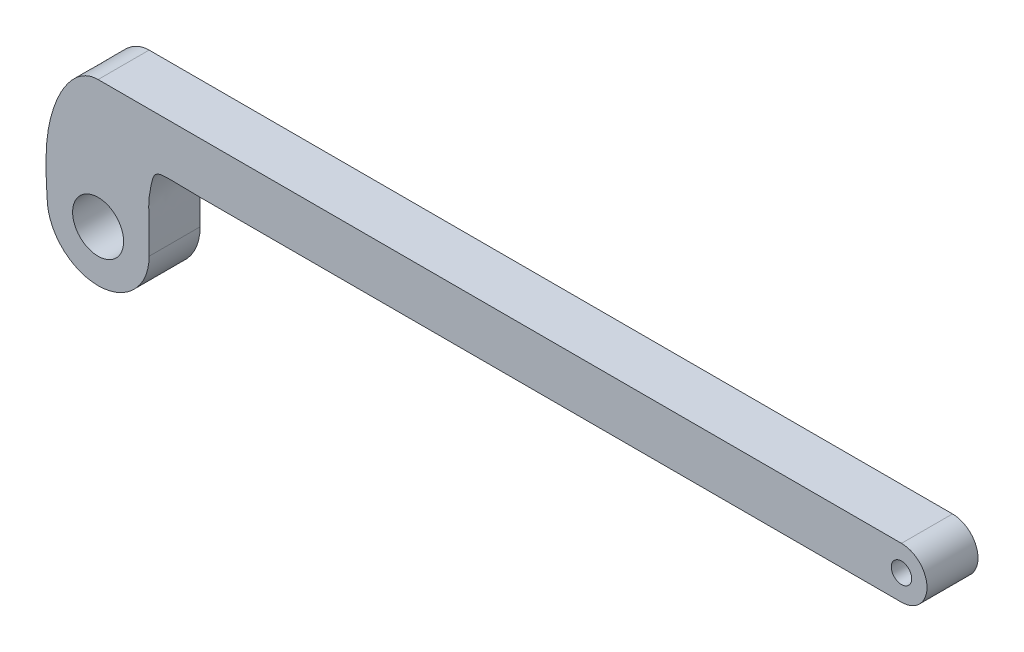
ISO-10303-21;
HEADER;
FILE_DESCRIPTION(('STEP AP214'),'2;1');
FILE_NAME('part.step','',(''),(''),'','','');
FILE_SCHEMA(('AUTOMOTIVE_DESIGN { 1 0 10303 214 1 1 1 1 }'));
ENDSEC;
DATA;
#1=APPLICATION_CONTEXT('core data for automotive mechanical design processes');
#2=APPLICATION_PROTOCOL_DEFINITION('international standard','automotive_design',2000,#1);
#3=PRODUCT_CONTEXT('',#1,'mechanical');
#4=PRODUCT('Part','Part','',(#3));
#5=PRODUCT_RELATED_PRODUCT_CATEGORY('part','',(#4));
#6=PRODUCT_DEFINITION_FORMATION('','',#4);
#7=PRODUCT_DEFINITION_CONTEXT('part definition',#1,'design');
#8=PRODUCT_DEFINITION('design','',#6,#7);
#9=PRODUCT_DEFINITION_SHAPE('','',#8);
#10=(LENGTH_UNIT() NAMED_UNIT(*) SI_UNIT(.MILLI.,.METRE.));
#11=(NAMED_UNIT(*) PLANE_ANGLE_UNIT() SI_UNIT($,.RADIAN.));
#12=(NAMED_UNIT(*) SI_UNIT($,.STERADIAN.) SOLID_ANGLE_UNIT());
#13=UNCERTAINTY_MEASURE_WITH_UNIT(LENGTH_MEASURE(1.E-05),#10,'distance_accuracy_value','');
#14=(GEOMETRIC_REPRESENTATION_CONTEXT(3) GLOBAL_UNCERTAINTY_ASSIGNED_CONTEXT((#13)) GLOBAL_UNIT_ASSIGNED_CONTEXT((#10,
#11,#12)) REPRESENTATION_CONTEXT('',''));
#15=CARTESIAN_POINT('',(0.,0.,0.));
#16=DIRECTION('',(0.,0.,1.));
#17=DIRECTION('',(1.,0.,0.));
#18=AXIS2_PLACEMENT_3D('',#15,#16,#17);
#19=CARTESIAN_POINT('',(-8.93869827663036,15.1604859074492,10.));
#20=DIRECTION('',(0.,0.,-1.));
#21=DIRECTION('',(-1.,0.,0.));
#22=AXIS2_PLACEMENT_3D('',#19,#20,#21);
#23=PLANE('',#22);
#24=CARTESIAN_POINT('',(0.,25.,10.));
#25=CARTESIAN_POINT('',(-4.93138797100949,25.,10.));
#26=CARTESIAN_POINT('',(-11.4057800435353,14.2397096644442,10.));
#27=CARTESIAN_POINT('',(-10.,0.681079819004998,10.));
#28=CARTESIAN_POINT('',(-10.,0.,10.));
#29=B_SPLINE_CURVE_WITH_KNOTS('',3,(#24,#25,#26,#27,#28),.UNSPECIFIED.,.F.,.F.,(4,1,4),(0.,
0.643210827674669,1.),.UNSPECIFIED.);
#30=CARTESIAN_POINT('',(0.,25.,10.));
#31=VERTEX_POINT('',#30);
#32=CARTESIAN_POINT('',(-10.,0.,10.));
#33=VERTEX_POINT('',#32);
#34=EDGE_CURVE('E146',#31,#33,#29,.T.);
#35=ORIENTED_EDGE('',*,*,#34,.T.);
#36=CARTESIAN_POINT('',(0.,0.,10.));
#37=DIRECTION('',(0.,0.,1.));
#38=DIRECTION('',(1.,0.,0.));
#39=AXIS2_PLACEMENT_3D('',#36,#37,#38);
#40=CIRCLE('',#39,10.);
#41=CARTESIAN_POINT('',(10.,0.,10.));
#42=VERTEX_POINT('',#41);
#43=EDGE_CURVE('E94',#33,#42,#40,.T.);
#44=ORIENTED_EDGE('',*,*,#43,.T.);
#45=CARTESIAN_POINT('',(10.,0.,10.));
#46=CARTESIAN_POINT('',(10.,6.79023703462106,10.));
#47=CARTESIAN_POINT('',(9.7760884483539,8.98660545435838,10.));
#48=CARTESIAN_POINT('',(11.0749283819489,16.1248158754713,10.));
#49=CARTESIAN_POINT('',(11.1995030270169,15.,10.));
#50=CARTESIAN_POINT('',(20.,15.,10.));
#51=B_SPLINE_CURVE_WITH_KNOTS('',3,(#45,#46,#47,#48,#49,#50),.UNSPECIFIED.,.F.,.F.,(4,1,1,4),
(0.,0.182751564047275,0.282751564047274,1.),.UNSPECIFIED.);
#52=CARTESIAN_POINT('',(20.,15.,10.));
#53=VERTEX_POINT('',#52);
#54=EDGE_CURVE('E107',#42,#53,#51,.T.);
#55=ORIENTED_EDGE('',*,*,#54,.T.);
#56=DIRECTION('',(1.,0.,0.));
#57=VECTOR('',#56,1.);
#58=CARTESIAN_POINT('',(20.,15.,10.));
#59=LINE('',#58,#57);
#60=CARTESIAN_POINT('',(157.485,15.,10.));
#61=VERTEX_POINT('',#60);
#62=EDGE_CURVE('E101',#53,#61,#59,.T.);
#63=ORIENTED_EDGE('',*,*,#62,.T.);
#64=CARTESIAN_POINT('',(157.485,20.,10.));
#65=DIRECTION('',(0.,0.,1.));
#66=DIRECTION('',(1.,0.,0.));
#67=AXIS2_PLACEMENT_3D('',#64,#65,#66);
#68=CIRCLE('',#67,5.);
#69=CARTESIAN_POINT('',(157.485,25.,10.));
#70=VERTEX_POINT('',#69);
#71=EDGE_CURVE('E105',#61,#70,#68,.T.);
#72=ORIENTED_EDGE('',*,*,#71,.T.);
#73=DIRECTION('',(-1.,0.,0.));
#74=VECTOR('',#73,1.);
#75=CARTESIAN_POINT('',(0.,25.,10.));
#76=LINE('',#75,#74);
#77=EDGE_CURVE('E57',#70,#31,#76,.T.);
#78=ORIENTED_EDGE('',*,*,#77,.T.);
#79=EDGE_LOOP('',(#35,#44,#55,#63,#72,#78));
#80=FACE_BOUND('',#79,.T.);
#81=CARTESIAN_POINT('',(0.,0.,10.));
#82=DIRECTION('',(0.,0.,1.));
#83=DIRECTION('',(1.,0.,0.));
#84=AXIS2_PLACEMENT_3D('',#81,#82,#83);
#85=CIRCLE('',#84,5.);
#86=CARTESIAN_POINT('',(5.,0.,10.));
#87=VERTEX_POINT('',#86);
#88=EDGE_CURVE('E131',#87,#87,#85,.T.);
#89=ORIENTED_EDGE('',*,*,#88,.F.);
#90=EDGE_LOOP('',(#89));
#91=FACE_BOUND('',#90,.T.);
#92=CARTESIAN_POINT('',(157.485,20.,10.));
#93=DIRECTION('',(0.,0.,1.));
#94=DIRECTION('',(1.,0.,0.));
#95=AXIS2_PLACEMENT_3D('',#92,#93,#94);
#96=CIRCLE('',#95,2.00000000000001);
#97=CARTESIAN_POINT('',(159.485,20.,10.));
#98=VERTEX_POINT('',#97);
#99=EDGE_CURVE('E187',#98,#98,#96,.T.);
#100=ORIENTED_EDGE('',*,*,#99,.F.);
#101=EDGE_LOOP('',(#100));
#102=FACE_BOUND('',#101,.T.);
#103=ADVANCED_FACE('F39',(#80,#91,#102),#23,.F.);
#104=CARTESIAN_POINT('',(-8.93869827663036,15.1604859074492,0.));
#105=DIRECTION('',(0.,0.,-1.));
#106=DIRECTION('',(-1.,0.,0.));
#107=AXIS2_PLACEMENT_3D('',#104,#105,#106);
#108=PLANE('',#107);
#109=CARTESIAN_POINT('',(0.,0.,0.));
#110=DIRECTION('',(0.,0.,1.));
#111=DIRECTION('',(1.,0.,0.));
#112=AXIS2_PLACEMENT_3D('',#109,#110,#111);
#113=CIRCLE('',#112,5.);
#114=CARTESIAN_POINT('',(5.,0.,0.));
#115=VERTEX_POINT('',#114);
#116=EDGE_CURVE('E192',#115,#115,#113,.T.);
#117=ORIENTED_EDGE('',*,*,#116,.T.);
#118=EDGE_LOOP('',(#117));
#119=FACE_BOUND('',#118,.T.);
#120=CARTESIAN_POINT('',(0.,25.,0.));
#121=CARTESIAN_POINT('',(-4.93138797100949,25.,0.));
#122=CARTESIAN_POINT('',(-11.4057800435353,14.2397096644442,0.));
#123=CARTESIAN_POINT('',(-10.,0.681079819004998,0.));
#124=CARTESIAN_POINT('',(-10.,0.,0.));
#125=B_SPLINE_CURVE_WITH_KNOTS('',3,(#120,#121,#122,#123,#124),.UNSPECIFIED.,.F.,.F.,(4,1,4),
(0.,0.643210827674669,1.),.UNSPECIFIED.);
#126=CARTESIAN_POINT('',(0.,25.,0.));
#127=VERTEX_POINT('',#126);
#128=CARTESIAN_POINT('',(-10.,0.,0.));
#129=VERTEX_POINT('',#128);
#130=EDGE_CURVE('E125',#127,#129,#125,.T.);
#131=ORIENTED_EDGE('',*,*,#130,.F.);
#132=DIRECTION('',(-1.,0.,0.));
#133=VECTOR('',#132,1.);
#134=CARTESIAN_POINT('',(0.,25.,0.));
#135=LINE('',#134,#133);
#136=CARTESIAN_POINT('',(157.485,25.,0.));
#137=VERTEX_POINT('',#136);
#138=EDGE_CURVE('E86',#137,#127,#135,.T.);
#139=ORIENTED_EDGE('',*,*,#138,.F.);
#140=CARTESIAN_POINT('',(157.485,20.,0.));
#141=DIRECTION('',(0.,0.,1.));
#142=DIRECTION('',(1.,0.,0.));
#143=AXIS2_PLACEMENT_3D('',#140,#141,#142);
#144=CIRCLE('',#143,5.);
#145=CARTESIAN_POINT('',(157.485,15.,0.));
#146=VERTEX_POINT('',#145);
#147=EDGE_CURVE('E80',#146,#137,#144,.T.);
#148=ORIENTED_EDGE('',*,*,#147,.F.);
#149=DIRECTION('',(1.,0.,0.));
#150=VECTOR('',#149,1.);
#151=CARTESIAN_POINT('',(20.,15.,0.));
#152=LINE('',#151,#150);
#153=CARTESIAN_POINT('',(20.,15.,0.));
#154=VERTEX_POINT('',#153);
#155=EDGE_CURVE('E115',#154,#146,#152,.T.);
#156=ORIENTED_EDGE('',*,*,#155,.F.);
#157=CARTESIAN_POINT('',(10.,0.,0.));
#158=CARTESIAN_POINT('',(10.,6.79023703462106,0.));
#159=CARTESIAN_POINT('',(9.7760884483539,8.98660545435838,0.));
#160=CARTESIAN_POINT('',(11.0749283819489,16.1248158754713,0.));
#161=CARTESIAN_POINT('',(11.1995030270169,15.,0.));
#162=CARTESIAN_POINT('',(20.,15.,0.));
#163=B_SPLINE_CURVE_WITH_KNOTS('',3,(#157,#158,#159,#160,#161,#162),.UNSPECIFIED.,.F.,.F.,(4,1,
1,4),(0.,0.182751564047275,0.282751564047274,1.),.UNSPECIFIED.);
#164=CARTESIAN_POINT('',(10.,0.,0.));
#165=VERTEX_POINT('',#164);
#166=EDGE_CURVE('E136',#165,#154,#163,.T.);
#167=ORIENTED_EDGE('',*,*,#166,.F.);
#168=CARTESIAN_POINT('',(0.,0.,0.));
#169=DIRECTION('',(0.,0.,1.));
#170=DIRECTION('',(1.,0.,0.));
#171=AXIS2_PLACEMENT_3D('',#168,#169,#170);
#172=CIRCLE('',#171,10.);
#173=EDGE_CURVE('E130',#129,#165,#172,.T.);
#174=ORIENTED_EDGE('',*,*,#173,.F.);
#175=EDGE_LOOP('',(#131,#139,#148,#156,#167,#174));
#176=FACE_BOUND('',#175,.T.);
#177=CARTESIAN_POINT('',(157.485,20.,0.));
#178=DIRECTION('',(0.,0.,1.));
#179=DIRECTION('',(1.,0.,0.));
#180=AXIS2_PLACEMENT_3D('',#177,#178,#179);
#181=CIRCLE('',#180,2.00000000000001);
#182=CARTESIAN_POINT('',(159.485,20.,0.));
#183=VERTEX_POINT('',#182);
#184=EDGE_CURVE('E190',#183,#183,#181,.T.);
#185=ORIENTED_EDGE('',*,*,#184,.T.);
#186=EDGE_LOOP('',(#185));
#187=FACE_BOUND('',#186,.T.);
#188=ADVANCED_FACE('F155',(#119,#176,#187),#108,.T.);
#189=DIRECTION('',(0.,0.,-1.));
#190=VECTOR('',#189,1.);
#191=SURFACE_OF_LINEAR_EXTRUSION('',#29,#190);
#192=ORIENTED_EDGE('',*,*,#130,.T.);
#193=DIRECTION('',(0.,0.,-1.));
#194=VECTOR('',#193,1.);
#195=CARTESIAN_POINT('',(-10.,0.,10.));
#196=LINE('',#195,#194);
#197=EDGE_CURVE('E11',#33,#129,#196,.T.);
#198=ORIENTED_EDGE('',*,*,#197,.F.);
#199=ORIENTED_EDGE('',*,*,#34,.F.);
#200=DIRECTION('',(0.,0.,-1.));
#201=VECTOR('',#200,1.);
#202=CARTESIAN_POINT('',(0.,25.,10.));
#203=LINE('',#202,#201);
#204=EDGE_CURVE('E121',#31,#127,#203,.T.);
#205=ORIENTED_EDGE('',*,*,#204,.T.);
#206=EDGE_LOOP('',(#192,#198,#199,#205));
#207=FACE_BOUND('',#206,.T.);
#208=ADVANCED_FACE('F41',(#207),#191,.F.);
#209=CARTESIAN_POINT('',(0.,0.,10.));
#210=DIRECTION('',(0.,0.,-1.));
#211=DIRECTION('',(-1.,0.,0.));
#212=AXIS2_PLACEMENT_3D('',#209,#210,#211);
#213=CYLINDRICAL_SURFACE('',#212,10.);
#214=ORIENTED_EDGE('',*,*,#173,.T.);
#215=DIRECTION('',(0.,0.,-1.));
#216=VECTOR('',#215,1.);
#217=CARTESIAN_POINT('',(10.,0.,10.));
#218=LINE('',#217,#216);
#219=EDGE_CURVE('E49',#42,#165,#218,.T.);
#220=ORIENTED_EDGE('',*,*,#219,.F.);
#221=ORIENTED_EDGE('',*,*,#43,.F.);
#222=ORIENTED_EDGE('',*,*,#197,.T.);
#223=EDGE_LOOP('',(#214,#220,#221,#222));
#224=FACE_BOUND('',#223,.T.);
#225=ADVANCED_FACE('F214',(#224),#213,.T.);
#226=DIRECTION('',(0.,0.,-1.));
#227=VECTOR('',#226,1.);
#228=SURFACE_OF_LINEAR_EXTRUSION('',#51,#227);
#229=ORIENTED_EDGE('',*,*,#166,.T.);
#230=DIRECTION('',(0.,0.,-1.));
#231=VECTOR('',#230,1.);
#232=CARTESIAN_POINT('',(20.,15.,10.));
#233=LINE('',#232,#231);
#234=EDGE_CURVE('E116',#53,#154,#233,.T.);
#235=ORIENTED_EDGE('',*,*,#234,.F.);
#236=ORIENTED_EDGE('',*,*,#54,.F.);
#237=ORIENTED_EDGE('',*,*,#219,.T.);
#238=EDGE_LOOP('',(#229,#235,#236,#237));
#239=FACE_BOUND('',#238,.T.);
#240=ADVANCED_FACE('F152',(#239),#228,.F.);
#241=CARTESIAN_POINT('',(20.,15.,10.));
#242=DIRECTION('',(0.,1.,0.));
#243=DIRECTION('',(-1.,0.,0.));
#244=AXIS2_PLACEMENT_3D('',#241,#242,#243);
#245=PLANE('',#244);
#246=ORIENTED_EDGE('',*,*,#155,.T.);
#247=DIRECTION('',(0.,0.,-1.));
#248=VECTOR('',#247,1.);
#249=CARTESIAN_POINT('',(157.485,15.,10.));
#250=LINE('',#249,#248);
#251=EDGE_CURVE('E112',#61,#146,#250,.T.);
#252=ORIENTED_EDGE('',*,*,#251,.F.);
#253=ORIENTED_EDGE('',*,*,#62,.F.);
#254=ORIENTED_EDGE('',*,*,#234,.T.);
#255=EDGE_LOOP('',(#246,#252,#253,#254));
#256=FACE_BOUND('',#255,.T.);
#257=ADVANCED_FACE('F113',(#256),#245,.F.);
#258=CARTESIAN_POINT('',(157.485,20.,10.));
#259=DIRECTION('',(0.,0.,-1.));
#260=DIRECTION('',(-1.,0.,0.));
#261=AXIS2_PLACEMENT_3D('',#258,#259,#260);
#262=CYLINDRICAL_SURFACE('',#261,5.);
#263=ORIENTED_EDGE('',*,*,#147,.T.);
#264=DIRECTION('',(0.,0.,-1.));
#265=VECTOR('',#264,1.);
#266=CARTESIAN_POINT('',(157.485,25.,10.));
#267=LINE('',#266,#265);
#268=EDGE_CURVE('E117',#70,#137,#267,.T.);
#269=ORIENTED_EDGE('',*,*,#268,.F.);
#270=ORIENTED_EDGE('',*,*,#71,.F.);
#271=ORIENTED_EDGE('',*,*,#251,.T.);
#272=EDGE_LOOP('',(#263,#269,#270,#271));
#273=FACE_BOUND('',#272,.T.);
#274=ADVANCED_FACE('F119',(#273),#262,.T.);
#275=CARTESIAN_POINT('',(0.,25.,10.));
#276=DIRECTION('',(0.,-1.,0.));
#277=DIRECTION('',(1.,0.,0.));
#278=AXIS2_PLACEMENT_3D('',#275,#276,#277);
#279=PLANE('',#278);
#280=ORIENTED_EDGE('',*,*,#138,.T.);
#281=ORIENTED_EDGE('',*,*,#204,.F.);
#282=ORIENTED_EDGE('',*,*,#77,.F.);
#283=ORIENTED_EDGE('',*,*,#268,.T.);
#284=EDGE_LOOP('',(#280,#281,#282,#283));
#285=FACE_BOUND('',#284,.T.);
#286=ADVANCED_FACE('F160',(#285),#279,.F.);
#287=CARTESIAN_POINT('',(0.,0.,10.));
#288=DIRECTION('',(0.,0.,-1.));
#289=DIRECTION('',(-1.,0.,0.));
#290=AXIS2_PLACEMENT_3D('',#287,#288,#289);
#291=CYLINDRICAL_SURFACE('',#290,5.);
#292=ORIENTED_EDGE('',*,*,#88,.T.);
#293=EDGE_LOOP('',(#292));
#294=FACE_BOUND('',#293,.T.);
#295=ORIENTED_EDGE('',*,*,#116,.F.);
#296=EDGE_LOOP('',(#295));
#297=FACE_BOUND('',#296,.T.);
#298=ADVANCED_FACE('F162',(#294,#297),#291,.F.);
#299=CARTESIAN_POINT('',(157.485,20.,10.));
#300=DIRECTION('',(0.,0.,-1.));
#301=DIRECTION('',(-1.,0.,0.));
#302=AXIS2_PLACEMENT_3D('',#299,#300,#301);
#303=CYLINDRICAL_SURFACE('',#302,2.00000000000001);
#304=ORIENTED_EDGE('',*,*,#99,.T.);
#305=EDGE_LOOP('',(#304));
#306=FACE_BOUND('',#305,.T.);
#307=ORIENTED_EDGE('',*,*,#184,.F.);
#308=EDGE_LOOP('',(#307));
#309=FACE_BOUND('',#308,.T.);
#310=ADVANCED_FACE('F168',(#306,#309),#303,.F.);
#311=CLOSED_SHELL('',(#103,#188,#208,#225,#240,#257,#274,#286,#298,#310));
#312=MANIFOLD_SOLID_BREP('B2',#311);
#313=ADVANCED_BREP_SHAPE_REPRESENTATION('',(#18,#312),#14);
#314=SHAPE_DEFINITION_REPRESENTATION(#9,#313);
ENDSEC;
END-ISO-10303-21;
